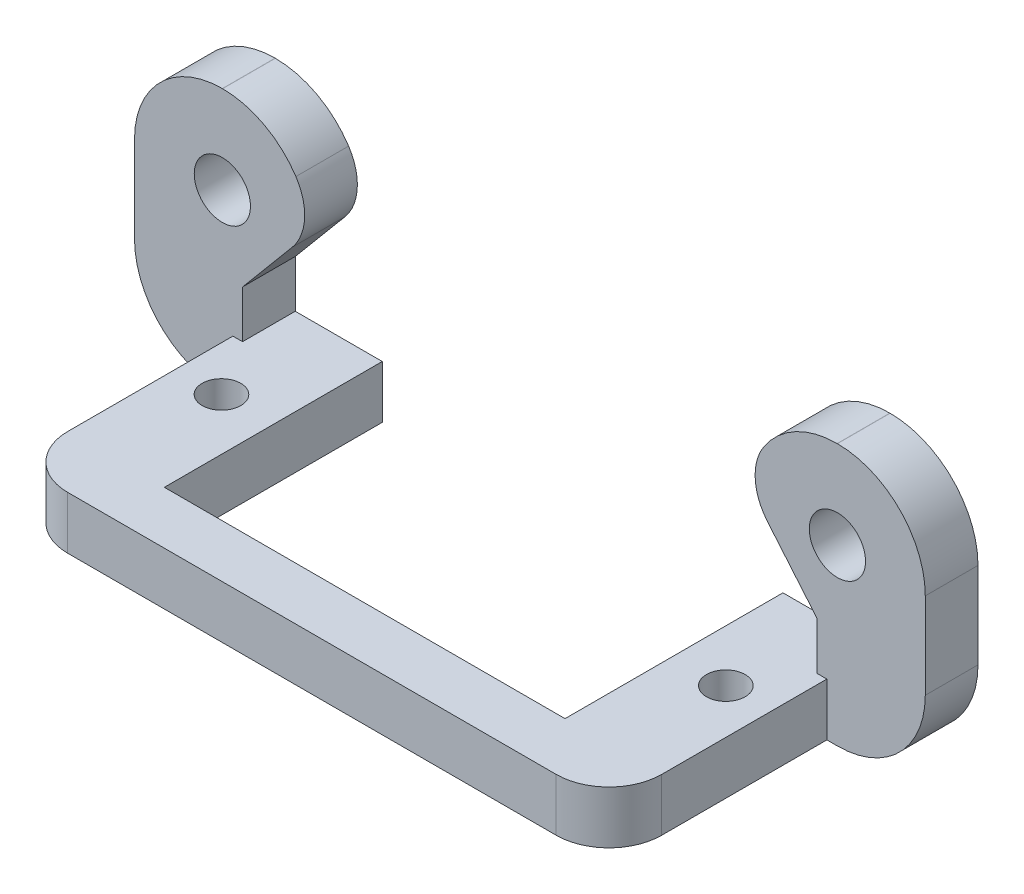
ISO-10303-21;
HEADER;
FILE_DESCRIPTION(('STEP AP214'),'2;1');
FILE_NAME('part.step','',(''),(''),'','','');
FILE_SCHEMA(('AUTOMOTIVE_DESIGN { 1 0 10303 214 1 1 1 1 }'));
ENDSEC;
DATA;
#1=APPLICATION_CONTEXT('core data for automotive mechanical design processes');
#2=APPLICATION_PROTOCOL_DEFINITION('international standard','automotive_design',2000,#1);
#3=PRODUCT_CONTEXT('',#1,'mechanical');
#4=PRODUCT('Part','Part','',(#3));
#5=PRODUCT_RELATED_PRODUCT_CATEGORY('part','',(#4));
#6=PRODUCT_DEFINITION_FORMATION('','',#4);
#7=PRODUCT_DEFINITION_CONTEXT('part definition',#1,'design');
#8=PRODUCT_DEFINITION('design','',#6,#7);
#9=PRODUCT_DEFINITION_SHAPE('','',#8);
#10=(LENGTH_UNIT() NAMED_UNIT(*) SI_UNIT(.MILLI.,.METRE.));
#11=(NAMED_UNIT(*) PLANE_ANGLE_UNIT() SI_UNIT($,.RADIAN.));
#12=(NAMED_UNIT(*) SI_UNIT($,.STERADIAN.) SOLID_ANGLE_UNIT());
#13=UNCERTAINTY_MEASURE_WITH_UNIT(LENGTH_MEASURE(1.E-05),#10,'distance_accuracy_value','');
#14=(GEOMETRIC_REPRESENTATION_CONTEXT(3) GLOBAL_UNCERTAINTY_ASSIGNED_CONTEXT((#13)) GLOBAL_UNIT_ASSIGNED_CONTEXT((#10,
#11,#12)) REPRESENTATION_CONTEXT('',''));
#15=CARTESIAN_POINT('',(0.,0.,0.));
#16=DIRECTION('',(0.,0.,1.));
#17=DIRECTION('',(1.,0.,0.));
#18=AXIS2_PLACEMENT_3D('',#15,#16,#17);
#19=CARTESIAN_POINT('',(16.9,3.,0.));
#20=DIRECTION('',(-1.,0.,0.));
#21=DIRECTION('',(0.,0.,1.));
#22=AXIS2_PLACEMENT_3D('',#19,#20,#21);
#23=PLANE('',#22);
#24=DIRECTION('',(0.,-1.,0.));
#25=VECTOR('',#24,1.);
#26=CARTESIAN_POINT('',(16.9,0.,-3.2));
#27=LINE('',#26,#25);
#28=CARTESIAN_POINT('',(16.9,3.,-3.2));
#29=VERTEX_POINT('',#28);
#30=CARTESIAN_POINT('',(16.9,0.,-3.2));
#31=VERTEX_POINT('',#30);
#32=EDGE_CURVE('E254',#29,#31,#27,.T.);
#33=ORIENTED_EDGE('',*,*,#32,.F.);
#34=DIRECTION('',(0.,0.,-1.));
#35=VECTOR('',#34,1.);
#36=CARTESIAN_POINT('',(16.9,3.,0.));
#37=LINE('',#36,#35);
#38=CARTESIAN_POINT('',(16.9,3.,6.2));
#39=VERTEX_POINT('',#38);
#40=EDGE_CURVE('E318',#39,#29,#37,.T.);
#41=ORIENTED_EDGE('',*,*,#40,.F.);
#42=DIRECTION('',(0.,-1.,0.));
#43=VECTOR('',#42,1.);
#44=CARTESIAN_POINT('',(16.9,3.,6.2));
#45=LINE('',#44,#43);
#46=CARTESIAN_POINT('',(16.9,0.,6.2));
#47=VERTEX_POINT('',#46);
#48=EDGE_CURVE('E376',#39,#47,#45,.T.);
#49=ORIENTED_EDGE('',*,*,#48,.T.);
#50=DIRECTION('',(0.,0.,-1.));
#51=VECTOR('',#50,1.);
#52=CARTESIAN_POINT('',(16.9,0.,0.));
#53=LINE('',#52,#51);
#54=EDGE_CURVE('E346',#47,#31,#53,.T.);
#55=ORIENTED_EDGE('',*,*,#54,.T.);
#56=EDGE_LOOP('',(#33,#41,#49,#55));
#57=FACE_BOUND('',#56,.T.);
#58=ADVANCED_FACE('F40',(#57),#23,.F.);
#59=CARTESIAN_POINT('',(-16.9,3.,0.));
#60=DIRECTION('',(-1.,0.,0.));
#61=DIRECTION('',(0.,0.,1.));
#62=AXIS2_PLACEMENT_3D('',#59,#60,#61);
#63=PLANE('',#62);
#64=DIRECTION('',(0.,0.,-1.));
#65=VECTOR('',#64,1.);
#66=CARTESIAN_POINT('',(-16.9,3.,0.));
#67=LINE('',#66,#65);
#68=CARTESIAN_POINT('',(-16.9,3.,6.2));
#69=VERTEX_POINT('',#68);
#70=CARTESIAN_POINT('',(-16.9,3.00000000000002,-3.2));
#71=VERTEX_POINT('',#70);
#72=EDGE_CURVE('E311',#69,#71,#67,.T.);
#73=ORIENTED_EDGE('',*,*,#72,.T.);
#74=DIRECTION('',(0.,1.,0.));
#75=VECTOR('',#74,1.);
#76=CARTESIAN_POINT('',(-16.9,0.,-3.2));
#77=LINE('',#76,#75);
#78=CARTESIAN_POINT('',(-16.9,0.,-3.2));
#79=VERTEX_POINT('',#78);
#80=EDGE_CURVE('E287',#79,#71,#77,.T.);
#81=ORIENTED_EDGE('',*,*,#80,.F.);
#82=DIRECTION('',(0.,0.,-1.));
#83=VECTOR('',#82,1.);
#84=CARTESIAN_POINT('',(-16.9,0.,0.));
#85=LINE('',#84,#83);
#86=CARTESIAN_POINT('',(-16.9,0.,6.2));
#87=VERTEX_POINT('',#86);
#88=EDGE_CURVE('E308',#87,#79,#85,.T.);
#89=ORIENTED_EDGE('',*,*,#88,.F.);
#90=DIRECTION('',(0.,-1.,0.));
#91=VECTOR('',#90,1.);
#92=CARTESIAN_POINT('',(-16.9,3.,6.2));
#93=LINE('',#92,#91);
#94=EDGE_CURVE('E392',#87,#69,#93,.F.);
#95=ORIENTED_EDGE('',*,*,#94,.T.);
#96=EDGE_LOOP('',(#73,#81,#89,#95));
#97=FACE_BOUND('',#96,.T.);
#98=ADVANCED_FACE('F493',(#97),#63,.T.);
#99=CARTESIAN_POINT('',(0.,3.,0.));
#100=DIRECTION('',(0.,1.,0.));
#101=DIRECTION('',(0.,0.,1.));
#102=AXIS2_PLACEMENT_3D('',#99,#100,#101);
#103=PLANE('',#102);
#104=DIRECTION('',(0.,0.,-1.));
#105=VECTOR('',#104,1.);
#106=CARTESIAN_POINT('',(16.35,3.,-3.2));
#107=LINE('',#106,#105);
#108=CARTESIAN_POINT('',(16.35,3.,-3.2));
#109=VERTEX_POINT('',#108);
#110=CARTESIAN_POINT('',(16.35,3.,-6.2));
#111=VERTEX_POINT('',#110);
#112=EDGE_CURVE('E238',#109,#111,#107,.T.);
#113=ORIENTED_EDGE('',*,*,#112,.T.);
#114=DIRECTION('',(1.,0.,0.));
#115=VECTOR('',#114,1.);
#116=CARTESIAN_POINT('',(0.,3.,-6.2));
#117=LINE('',#116,#115);
#118=CARTESIAN_POINT('',(11.4,3.,-6.2));
#119=VERTEX_POINT('',#118);
#120=EDGE_CURVE('E321',#119,#111,#117,.T.);
#121=ORIENTED_EDGE('',*,*,#120,.F.);
#122=DIRECTION('',(0.,0.,-1.));
#123=VECTOR('',#122,1.);
#124=CARTESIAN_POINT('',(11.4,3.,0.));
#125=LINE('',#124,#123);
#126=CARTESIAN_POINT('',(11.4,3.,6.2));
#127=VERTEX_POINT('',#126);
#128=EDGE_CURVE('E324',#127,#119,#125,.T.);
#129=ORIENTED_EDGE('',*,*,#128,.F.);
#130=DIRECTION('',(-1.,0.,0.));
#131=VECTOR('',#130,1.);
#132=CARTESIAN_POINT('',(0.,3.,6.2));
#133=LINE('',#132,#131);
#134=CARTESIAN_POINT('',(-11.4,3.,6.2));
#135=VERTEX_POINT('',#134);
#136=EDGE_CURVE('E327',#127,#135,#133,.T.);
#137=ORIENTED_EDGE('',*,*,#136,.T.);
#138=DIRECTION('',(0.,0.,-1.));
#139=VECTOR('',#138,1.);
#140=CARTESIAN_POINT('',(-11.4,3.,0.));
#141=LINE('',#140,#139);
#142=CARTESIAN_POINT('',(-11.4,3.,-6.2));
#143=VERTEX_POINT('',#142);
#144=EDGE_CURVE('E329',#135,#143,#141,.T.);
#145=ORIENTED_EDGE('',*,*,#144,.T.);
#146=DIRECTION('',(-1.,0.,0.));
#147=VECTOR('',#146,1.);
#148=CARTESIAN_POINT('',(0.,3.,-6.2));
#149=LINE('',#148,#147);
#150=CARTESIAN_POINT('',(-16.35,3.00000000000002,-6.2));
#151=VERTEX_POINT('',#150);
#152=EDGE_CURVE('E331',#143,#151,#149,.T.);
#153=ORIENTED_EDGE('',*,*,#152,.T.);
#154=DIRECTION('',(0.,0.,-1.));
#155=VECTOR('',#154,1.);
#156=CARTESIAN_POINT('',(-16.35,3.00000000000002,-3.2));
#157=LINE('',#156,#155);
#158=CARTESIAN_POINT('',(-16.35,3.00000000000002,-3.2));
#159=VERTEX_POINT('',#158);
#160=EDGE_CURVE('E306',#159,#151,#157,.T.);
#161=ORIENTED_EDGE('',*,*,#160,.F.);
#162=DIRECTION('',(1.,0.,0.));
#163=VECTOR('',#162,1.);
#164=CARTESIAN_POINT('',(0.,2.99999999999992,-3.2));
#165=LINE('',#164,#163);
#166=EDGE_CURVE('E285',#71,#159,#165,.T.);
#167=ORIENTED_EDGE('',*,*,#166,.F.);
#168=ORIENTED_EDGE('',*,*,#72,.F.);
#169=CARTESIAN_POINT('',(-13.9,3.,6.2));
#170=DIRECTION('',(0.,1.,0.));
#171=DIRECTION('',(0.,0.,1.));
#172=AXIS2_PLACEMENT_3D('',#169,#170,#171);
#173=CIRCLE('',#172,3.);
#174=CARTESIAN_POINT('',(-13.9,3.,9.2));
#175=VERTEX_POINT('',#174);
#176=EDGE_CURVE('E388',#69,#175,#173,.T.);
#177=ORIENTED_EDGE('',*,*,#176,.T.);
#178=DIRECTION('',(1.,0.,0.));
#179=VECTOR('',#178,1.);
#180=CARTESIAN_POINT('',(0.,3.,9.2));
#181=LINE('',#180,#179);
#182=CARTESIAN_POINT('',(13.9,3.,9.2));
#183=VERTEX_POINT('',#182);
#184=EDGE_CURVE('E314',#175,#183,#181,.T.);
#185=ORIENTED_EDGE('',*,*,#184,.T.);
#186=CARTESIAN_POINT('',(13.9,3.,6.2));
#187=DIRECTION('',(0.,1.,0.));
#188=DIRECTION('',(0.,0.,1.));
#189=AXIS2_PLACEMENT_3D('',#186,#187,#188);
#190=CIRCLE('',#189,3.);
#191=EDGE_CURVE('E390',#183,#39,#190,.T.);
#192=ORIENTED_EDGE('',*,*,#191,.T.);
#193=ORIENTED_EDGE('',*,*,#40,.T.);
#194=DIRECTION('',(1.,0.,0.));
#195=VECTOR('',#194,1.);
#196=CARTESIAN_POINT('',(0.,3.,-3.2));
#197=LINE('',#196,#195);
#198=EDGE_CURVE('E252',#109,#29,#197,.T.);
#199=ORIENTED_EDGE('',*,*,#198,.F.);
#200=EDGE_LOOP('',(#113,#121,#129,#137,#145,#153,#161,#167,#168,#177,#185,#192,#193,#199));
#201=FACE_BOUND('',#200,.T.);
#202=CARTESIAN_POINT('',(-14.35,3.,0.));
#203=DIRECTION('',(0.,1.,0.));
#204=DIRECTION('',(0.,0.,1.));
#205=AXIS2_PLACEMENT_3D('',#202,#203,#204);
#206=CIRCLE('',#205,1.1);
#207=CARTESIAN_POINT('',(-14.35,3.,1.1));
#208=VERTEX_POINT('',#207);
#209=EDGE_CURVE('E334',#208,#208,#206,.T.);
#210=ORIENTED_EDGE('',*,*,#209,.F.);
#211=EDGE_LOOP('',(#210));
#212=FACE_BOUND('',#211,.T.);
#213=CARTESIAN_POINT('',(14.35,3.,0.));
#214=DIRECTION('',(0.,1.,0.));
#215=DIRECTION('',(0.,0.,1.));
#216=AXIS2_PLACEMENT_3D('',#213,#214,#215);
#217=CIRCLE('',#216,1.1);
#218=CARTESIAN_POINT('',(14.35,3.,1.1));
#219=VERTEX_POINT('',#218);
#220=EDGE_CURVE('E337',#219,#219,#217,.F.);
#221=ORIENTED_EDGE('',*,*,#220,.T.);
#222=EDGE_LOOP('',(#221));
#223=FACE_BOUND('',#222,.T.);
#224=ADVANCED_FACE('F501',(#201,#212,#223),#103,.T.);
#225=CARTESIAN_POINT('',(0.,3.,9.2));
#226=DIRECTION('',(0.,0.,-1.));
#227=DIRECTION('',(-1.,0.,0.));
#228=AXIS2_PLACEMENT_3D('',#225,#226,#227);
#229=PLANE('',#228);
#230=DIRECTION('',(1.,0.,0.));
#231=VECTOR('',#230,1.);
#232=CARTESIAN_POINT('',(0.,0.,9.2));
#233=LINE('',#232,#231);
#234=CARTESIAN_POINT('',(-13.9,0.,9.2));
#235=VERTEX_POINT('',#234);
#236=CARTESIAN_POINT('',(13.9,0.,9.2));
#237=VERTEX_POINT('',#236);
#238=EDGE_CURVE('E343',#235,#237,#233,.T.);
#239=ORIENTED_EDGE('',*,*,#238,.T.);
#240=DIRECTION('',(0.,-1.,0.));
#241=VECTOR('',#240,1.);
#242=CARTESIAN_POINT('',(13.9,3.,9.2));
#243=LINE('',#242,#241);
#244=EDGE_CURVE('E386',#237,#183,#243,.F.);
#245=ORIENTED_EDGE('',*,*,#244,.T.);
#246=ORIENTED_EDGE('',*,*,#184,.F.);
#247=DIRECTION('',(0.,-1.,0.));
#248=VECTOR('',#247,1.);
#249=CARTESIAN_POINT('',(-13.9,0.,9.2));
#250=LINE('',#249,#248);
#251=EDGE_CURVE('E383',#175,#235,#250,.T.);
#252=ORIENTED_EDGE('',*,*,#251,.T.);
#253=EDGE_LOOP('',(#239,#245,#246,#252));
#254=FACE_BOUND('',#253,.T.);
#255=ADVANCED_FACE('F506',(#254),#229,.F.);
#256=CARTESIAN_POINT('',(0.,3.,-6.2));
#257=DIRECTION('',(0.,0.,-1.));
#258=DIRECTION('',(-1.,0.,0.));
#259=AXIS2_PLACEMENT_3D('',#256,#257,#258);
#260=PLANE('',#259);
#261=DIRECTION('',(-0.64278760968654,0.766044443118977,0.));
#262=VECTOR('',#261,1.);
#263=CARTESIAN_POINT('',(12.4012759485119,10.4059060745241,-6.2));
#264=LINE('',#263,#262);
#265=CARTESIAN_POINT('',(16.35,5.7,-6.2));
#266=VERTEX_POINT('',#265);
#267=CARTESIAN_POINT('',(13.5183862577821,9.07458585012734,-6.2));
#268=VERTEX_POINT('',#267);
#269=EDGE_CURVE('E232',#266,#268,#264,.T.);
#270=ORIENTED_EDGE('',*,*,#269,.T.);
#271=CARTESIAN_POINT('',(15.816519587139,11.002948679187,-6.2));
#272=DIRECTION('',(0.,0.,-1.));
#273=DIRECTION('',(-1.,0.,0.));
#274=AXIS2_PLACEMENT_3D('',#271,#272,#273);
#275=CIRCLE('',#274,3.);
#276=CARTESIAN_POINT('',(13.3139440188635,12.6573716979674,-6.2));
#277=VERTEX_POINT('',#276);
#278=EDGE_CURVE('E445',#268,#277,#275,.T.);
#279=ORIENTED_EDGE('',*,*,#278,.T.);
#280=CARTESIAN_POINT('',(17.4849032993227,9.90000000000001,-6.2));
#281=DIRECTION('',(0.,0.,-1.));
#282=DIRECTION('',(-1.,0.,0.));
#283=AXIS2_PLACEMENT_3D('',#280,#281,#282);
#284=CIRCLE('',#283,5.);
#285=CARTESIAN_POINT('',(17.4849032993227,14.9,-6.2));
#286=VERTEX_POINT('',#285);
#287=EDGE_CURVE('E401',#277,#286,#284,.T.);
#288=ORIENTED_EDGE('',*,*,#287,.T.);
#289=DIRECTION('',(-1.,0.,0.));
#290=VECTOR('',#289,1.);
#291=CARTESIAN_POINT('',(0.,14.9,-6.2));
#292=LINE('',#291,#290);
#293=CARTESIAN_POINT('',(17.5,14.9,-6.2));
#294=VERTEX_POINT('',#293);
#295=EDGE_CURVE('E269',#294,#286,#292,.T.);
#296=ORIENTED_EDGE('',*,*,#295,.F.);
#297=CARTESIAN_POINT('',(17.5,9.90000000000001,-6.2));
#298=DIRECTION('',(0.,0.,-1.));
#299=DIRECTION('',(-1.,0.,0.));
#300=AXIS2_PLACEMENT_3D('',#297,#298,#299);
#301=CIRCLE('',#300,5.);
#302=CARTESIAN_POINT('',(22.5,9.90000000000001,-6.2));
#303=VERTEX_POINT('',#302);
#304=EDGE_CURVE('E399',#294,#303,#301,.T.);
#305=ORIENTED_EDGE('',*,*,#304,.T.);
#306=DIRECTION('',(0.,-1.,0.));
#307=VECTOR('',#306,1.);
#308=CARTESIAN_POINT('',(22.5,0.,-6.2));
#309=LINE('',#308,#307);
#310=CARTESIAN_POINT('',(22.5,5.,-6.2));
#311=VERTEX_POINT('',#310);
#312=EDGE_CURVE('E263',#303,#311,#309,.T.);
#313=ORIENTED_EDGE('',*,*,#312,.T.);
#314=CARTESIAN_POINT('',(17.5,5.,-6.2));
#315=DIRECTION('',(0.,0.,-1.));
#316=DIRECTION('',(-1.,0.,0.));
#317=AXIS2_PLACEMENT_3D('',#314,#315,#316);
#318=CIRCLE('',#317,5.);
#319=CARTESIAN_POINT('',(17.5,0.,-6.2));
#320=VERTEX_POINT('',#319);
#321=EDGE_CURVE('E403',#311,#320,#318,.T.);
#322=ORIENTED_EDGE('',*,*,#321,.T.);
#323=DIRECTION('',(1.,0.,0.));
#324=VECTOR('',#323,1.);
#325=CARTESIAN_POINT('',(0.,0.,-6.2));
#326=LINE('',#325,#324);
#327=CARTESIAN_POINT('',(11.4,0.,-6.2));
#328=VERTEX_POINT('',#327);
#329=EDGE_CURVE('E349',#328,#320,#326,.T.);
#330=ORIENTED_EDGE('',*,*,#329,.F.);
#331=DIRECTION('',(0.,-1.,0.));
#332=VECTOR('',#331,1.);
#333=CARTESIAN_POINT('',(11.4,3.,-6.2));
#334=LINE('',#333,#332);
#335=EDGE_CURVE('E374',#119,#328,#334,.T.);
#336=ORIENTED_EDGE('',*,*,#335,.F.);
#337=ORIENTED_EDGE('',*,*,#120,.T.);
#338=DIRECTION('',(0.,1.,0.));
#339=VECTOR('',#338,1.);
#340=CARTESIAN_POINT('',(16.35,0.,-6.2));
#341=LINE('',#340,#339);
#342=EDGE_CURVE('E266',#111,#266,#341,.T.);
#343=ORIENTED_EDGE('',*,*,#342,.T.);
#344=EDGE_LOOP('',(#270,#279,#288,#296,#305,#313,#322,#330,#336,#337,#343));
#345=FACE_BOUND('',#344,.T.);
#346=CARTESIAN_POINT('',(17.5,9.90000000000001,-6.2));
#347=DIRECTION('',(0.,0.,-1.));
#348=DIRECTION('',(-1.,0.,0.));
#349=AXIS2_PLACEMENT_3D('',#346,#347,#348);
#350=CIRCLE('',#349,1.6);
#351=CARTESIAN_POINT('',(15.9,9.90000000000001,-6.2));
#352=VERTEX_POINT('',#351);
#353=EDGE_CURVE('E260',#352,#352,#350,.T.);
#354=ORIENTED_EDGE('',*,*,#353,.F.);
#355=EDGE_LOOP('',(#354));
#356=FACE_BOUND('',#355,.T.);
#357=ADVANCED_FACE('F532',(#345,#356),#260,.T.);
#358=CARTESIAN_POINT('',(11.4,3.,0.));
#359=DIRECTION('',(-1.,0.,0.));
#360=DIRECTION('',(0.,0.,1.));
#361=AXIS2_PLACEMENT_3D('',#358,#359,#360);
#362=PLANE('',#361);
#363=DIRECTION('',(0.,0.,-1.));
#364=VECTOR('',#363,1.);
#365=CARTESIAN_POINT('',(11.4,0.,0.));
#366=LINE('',#365,#364);
#367=CARTESIAN_POINT('',(11.4,0.,6.2));
#368=VERTEX_POINT('',#367);
#369=EDGE_CURVE('E352',#368,#328,#366,.T.);
#370=ORIENTED_EDGE('',*,*,#369,.F.);
#371=DIRECTION('',(0.,-1.,0.));
#372=VECTOR('',#371,1.);
#373=CARTESIAN_POINT('',(11.4,3.,6.2));
#374=LINE('',#373,#372);
#375=EDGE_CURVE('E372',#127,#368,#374,.T.);
#376=ORIENTED_EDGE('',*,*,#375,.F.);
#377=ORIENTED_EDGE('',*,*,#128,.T.);
#378=ORIENTED_EDGE('',*,*,#335,.T.);
#379=EDGE_LOOP('',(#370,#376,#377,#378));
#380=FACE_BOUND('',#379,.T.);
#381=ADVANCED_FACE('F534',(#380),#362,.T.);
#382=CARTESIAN_POINT('',(0.,3.,6.2));
#383=DIRECTION('',(0.,0.,1.));
#384=DIRECTION('',(1.,0.,0.));
#385=AXIS2_PLACEMENT_3D('',#382,#383,#384);
#386=PLANE('',#385);
#387=DIRECTION('',(-1.,0.,0.));
#388=VECTOR('',#387,1.);
#389=CARTESIAN_POINT('',(0.,0.,6.2));
#390=LINE('',#389,#388);
#391=CARTESIAN_POINT('',(-11.4,0.,6.2));
#392=VERTEX_POINT('',#391);
#393=EDGE_CURVE('E355',#368,#392,#390,.T.);
#394=ORIENTED_EDGE('',*,*,#393,.T.);
#395=DIRECTION('',(0.,-1.,0.));
#396=VECTOR('',#395,1.);
#397=CARTESIAN_POINT('',(-11.4,3.,6.2));
#398=LINE('',#397,#396);
#399=EDGE_CURVE('E369',#135,#392,#398,.T.);
#400=ORIENTED_EDGE('',*,*,#399,.F.);
#401=ORIENTED_EDGE('',*,*,#136,.F.);
#402=ORIENTED_EDGE('',*,*,#375,.T.);
#403=EDGE_LOOP('',(#394,#400,#401,#402));
#404=FACE_BOUND('',#403,.T.);
#405=ADVANCED_FACE('F542',(#404),#386,.F.);
#406=CARTESIAN_POINT('',(-11.4,3.,0.));
#407=DIRECTION('',(-1.,0.,0.));
#408=DIRECTION('',(0.,0.,1.));
#409=AXIS2_PLACEMENT_3D('',#406,#407,#408);
#410=PLANE('',#409);
#411=DIRECTION('',(0.,0.,-1.));
#412=VECTOR('',#411,1.);
#413=CARTESIAN_POINT('',(-11.4,0.,0.));
#414=LINE('',#413,#412);
#415=CARTESIAN_POINT('',(-11.4,0.,-6.2));
#416=VERTEX_POINT('',#415);
#417=EDGE_CURVE('E357',#392,#416,#414,.T.);
#418=ORIENTED_EDGE('',*,*,#417,.T.);
#419=DIRECTION('',(0.,-1.,0.));
#420=VECTOR('',#419,1.);
#421=CARTESIAN_POINT('',(-11.4,3.,-6.2));
#422=LINE('',#421,#420);
#423=EDGE_CURVE('E340',#143,#416,#422,.T.);
#424=ORIENTED_EDGE('',*,*,#423,.F.);
#425=ORIENTED_EDGE('',*,*,#144,.F.);
#426=ORIENTED_EDGE('',*,*,#399,.T.);
#427=EDGE_LOOP('',(#418,#424,#425,#426));
#428=FACE_BOUND('',#427,.T.);
#429=ADVANCED_FACE('F595',(#428),#410,.F.);
#430=CARTESIAN_POINT('',(-14.35,3.,0.));
#431=DIRECTION('',(0.,-1.,0.));
#432=DIRECTION('',(0.,0.,-1.));
#433=AXIS2_PLACEMENT_3D('',#430,#431,#432);
#434=CYLINDRICAL_SURFACE('',#433,1.1);
#435=ORIENTED_EDGE('',*,*,#209,.T.);
#436=EDGE_LOOP('',(#435));
#437=FACE_BOUND('',#436,.T.);
#438=CARTESIAN_POINT('',(-14.35,0.,0.));
#439=DIRECTION('',(0.,1.,0.));
#440=DIRECTION('',(0.,0.,1.));
#441=AXIS2_PLACEMENT_3D('',#438,#439,#440);
#442=CIRCLE('',#441,1.1);
#443=CARTESIAN_POINT('',(-14.35,0.,1.1));
#444=VERTEX_POINT('',#443);
#445=EDGE_CURVE('E362',#444,#444,#442,.T.);
#446=ORIENTED_EDGE('',*,*,#445,.F.);
#447=EDGE_LOOP('',(#446));
#448=FACE_BOUND('',#447,.T.);
#449=ADVANCED_FACE('F625',(#437,#448),#434,.F.);
#450=CARTESIAN_POINT('',(0.,3.,-6.2));
#451=DIRECTION('',(0.,0.,1.));
#452=DIRECTION('',(1.,0.,0.));
#453=AXIS2_PLACEMENT_3D('',#450,#451,#452);
#454=PLANE('',#453);
#455=CARTESIAN_POINT('',(-17.4849032993227,9.90000000000002,-6.2));
#456=DIRECTION('',(0.,0.,1.));
#457=DIRECTION('',(1.,0.,0.));
#458=AXIS2_PLACEMENT_3D('',#455,#456,#457);
#459=CIRCLE('',#458,5.);
#460=CARTESIAN_POINT('',(-17.4849032993227,14.9,-6.2));
#461=VERTEX_POINT('',#460);
#462=CARTESIAN_POINT('',(-13.3139440188635,12.6573716979674,-6.2));
#463=VERTEX_POINT('',#462);
#464=EDGE_CURVE('E416',#461,#463,#459,.F.);
#465=ORIENTED_EDGE('',*,*,#464,.T.);
#466=CARTESIAN_POINT('',(-15.816519587139,11.002948679187,-6.2));
#467=DIRECTION('',(0.,0.,1.));
#468=DIRECTION('',(1.,0.,0.));
#469=AXIS2_PLACEMENT_3D('',#466,#467,#468);
#470=CIRCLE('',#469,3.);
#471=CARTESIAN_POINT('',(-13.5183862577821,9.07458585012735,-6.2));
#472=VERTEX_POINT('',#471);
#473=EDGE_CURVE('E62',#463,#472,#470,.F.);
#474=ORIENTED_EDGE('',*,*,#473,.T.);
#475=DIRECTION('',(0.642787609686541,0.766044443118977,0.));
#476=VECTOR('',#475,1.);
#477=CARTESIAN_POINT('',(-12.4012759485119,10.4059060745241,-6.2));
#478=LINE('',#477,#476);
#479=CARTESIAN_POINT('',(-16.35,5.70000000000002,-6.2));
#480=VERTEX_POINT('',#479);
#481=EDGE_CURVE('E300',#480,#472,#478,.T.);
#482=ORIENTED_EDGE('',*,*,#481,.F.);
#483=DIRECTION('',(0.,1.,0.));
#484=VECTOR('',#483,1.);
#485=CARTESIAN_POINT('',(-16.35,0.,-6.2));
#486=LINE('',#485,#484);
#487=EDGE_CURVE('E302',#151,#480,#486,.T.);
#488=ORIENTED_EDGE('',*,*,#487,.F.);
#489=ORIENTED_EDGE('',*,*,#152,.F.);
#490=ORIENTED_EDGE('',*,*,#423,.T.);
#491=DIRECTION('',(-1.,0.,0.));
#492=VECTOR('',#491,1.);
#493=CARTESIAN_POINT('',(0.,0.,-6.2));
#494=LINE('',#493,#492);
#495=CARTESIAN_POINT('',(-17.5,0.,-6.2));
#496=VERTEX_POINT('',#495);
#497=EDGE_CURVE('E359',#416,#496,#494,.T.);
#498=ORIENTED_EDGE('',*,*,#497,.T.);
#499=CARTESIAN_POINT('',(-17.5,5.,-6.2));
#500=DIRECTION('',(0.,0.,1.));
#501=DIRECTION('',(1.,0.,0.));
#502=AXIS2_PLACEMENT_3D('',#499,#500,#501);
#503=CIRCLE('',#502,5.);
#504=CARTESIAN_POINT('',(-22.5,5.,-6.2));
#505=VERTEX_POINT('',#504);
#506=EDGE_CURVE('E420',#496,#505,#503,.F.);
#507=ORIENTED_EDGE('',*,*,#506,.T.);
#508=DIRECTION('',(0.,-1.,0.));
#509=VECTOR('',#508,1.);
#510=CARTESIAN_POINT('',(-22.5,0.,-6.2));
#511=LINE('',#510,#509);
#512=CARTESIAN_POINT('',(-22.5,9.90000000000002,-6.2));
#513=VERTEX_POINT('',#512);
#514=EDGE_CURVE('E237',#513,#505,#511,.T.);
#515=ORIENTED_EDGE('',*,*,#514,.F.);
#516=CARTESIAN_POINT('',(-17.5,9.90000000000002,-6.2));
#517=DIRECTION('',(0.,0.,1.));
#518=DIRECTION('',(1.,0.,0.));
#519=AXIS2_PLACEMENT_3D('',#516,#517,#518);
#520=CIRCLE('',#519,5.);
#521=CARTESIAN_POINT('',(-17.5,14.9,-6.2));
#522=VERTEX_POINT('',#521);
#523=EDGE_CURVE('E418',#513,#522,#520,.F.);
#524=ORIENTED_EDGE('',*,*,#523,.T.);
#525=DIRECTION('',(1.,0.,0.));
#526=VECTOR('',#525,1.);
#527=CARTESIAN_POINT('',(0.,14.9,-6.2));
#528=LINE('',#527,#526);
#529=EDGE_CURVE('E297',#522,#461,#528,.T.);
#530=ORIENTED_EDGE('',*,*,#529,.T.);
#531=EDGE_LOOP('',(#465,#474,#482,#488,#489,#490,#498,#507,#515,#524,#530));
#532=FACE_BOUND('',#531,.T.);
#533=CARTESIAN_POINT('',(-17.5,9.90000000000003,-6.2));
#534=DIRECTION('',(0.,0.,-1.));
#535=DIRECTION('',(-1.,0.,0.));
#536=AXIS2_PLACEMENT_3D('',#533,#534,#535);
#537=CIRCLE('',#536,1.6);
#538=CARTESIAN_POINT('',(-19.1,9.90000000000003,-6.2));
#539=VERTEX_POINT('',#538);
#540=EDGE_CURVE('E278',#539,#539,#537,.F.);
#541=ORIENTED_EDGE('',*,*,#540,.T.);
#542=EDGE_LOOP('',(#541));
#543=FACE_BOUND('',#542,.T.);
#544=ADVANCED_FACE('F460',(#532,#543),#454,.F.);
#545=CARTESIAN_POINT('',(14.35,3.,0.));
#546=DIRECTION('',(0.,-1.,0.));
#547=DIRECTION('',(0.,0.,-1.));
#548=AXIS2_PLACEMENT_3D('',#545,#546,#547);
#549=CYLINDRICAL_SURFACE('',#548,1.1);
#550=ORIENTED_EDGE('',*,*,#220,.F.);
#551=EDGE_LOOP('',(#550));
#552=FACE_BOUND('',#551,.T.);
#553=CARTESIAN_POINT('',(14.35,0.,0.));
#554=DIRECTION('',(0.,1.,0.));
#555=DIRECTION('',(0.,0.,1.));
#556=AXIS2_PLACEMENT_3D('',#553,#554,#555);
#557=CIRCLE('',#556,1.1);
#558=CARTESIAN_POINT('',(14.35,0.,1.1));
#559=VERTEX_POINT('',#558);
#560=EDGE_CURVE('E315',#559,#559,#557,.F.);
#561=ORIENTED_EDGE('',*,*,#560,.T.);
#562=EDGE_LOOP('',(#561));
#563=FACE_BOUND('',#562,.T.);
#564=ADVANCED_FACE('F621',(#552,#563),#549,.F.);
#565=CARTESIAN_POINT('',(0.,0.,0.));
#566=DIRECTION('',(0.,1.,0.));
#567=DIRECTION('',(0.,0.,1.));
#568=AXIS2_PLACEMENT_3D('',#565,#566,#567);
#569=PLANE('',#568);
#570=ORIENTED_EDGE('',*,*,#329,.T.);
#571=DIRECTION('',(0.,0.,-1.));
#572=VECTOR('',#571,1.);
#573=CARTESIAN_POINT('',(17.5,0.,-3.2));
#574=LINE('',#573,#572);
#575=CARTESIAN_POINT('',(17.5,0.,-3.2));
#576=VERTEX_POINT('',#575);
#577=EDGE_CURVE('E408',#320,#576,#574,.F.);
#578=ORIENTED_EDGE('',*,*,#577,.T.);
#579=DIRECTION('',(-1.,0.,0.));
#580=VECTOR('',#579,1.);
#581=CARTESIAN_POINT('',(0.,0.,-3.2));
#582=LINE('',#581,#580);
#583=EDGE_CURVE('E516',#576,#31,#582,.T.);
#584=ORIENTED_EDGE('',*,*,#583,.T.);
#585=ORIENTED_EDGE('',*,*,#54,.F.);
#586=CARTESIAN_POINT('',(13.9,0.,6.2));
#587=DIRECTION('',(0.,1.,0.));
#588=DIRECTION('',(0.,0.,1.));
#589=AXIS2_PLACEMENT_3D('',#586,#587,#588);
#590=CIRCLE('',#589,3.);
#591=EDGE_CURVE('E381',#47,#237,#590,.F.);
#592=ORIENTED_EDGE('',*,*,#591,.T.);
#593=ORIENTED_EDGE('',*,*,#238,.F.);
#594=CARTESIAN_POINT('',(-13.9,0.,6.2));
#595=DIRECTION('',(0.,1.,0.));
#596=DIRECTION('',(0.,0.,1.));
#597=AXIS2_PLACEMENT_3D('',#594,#595,#596);
#598=CIRCLE('',#597,3.);
#599=EDGE_CURVE('E379',#235,#87,#598,.F.);
#600=ORIENTED_EDGE('',*,*,#599,.T.);
#601=ORIENTED_EDGE('',*,*,#88,.T.);
#602=DIRECTION('',(1.,0.,0.));
#603=VECTOR('',#602,1.);
#604=CARTESIAN_POINT('',(0.,0.,-3.2));
#605=LINE('',#604,#603);
#606=CARTESIAN_POINT('',(-17.5,0.,-3.2));
#607=VERTEX_POINT('',#606);
#608=EDGE_CURVE('E289',#607,#79,#605,.T.);
#609=ORIENTED_EDGE('',*,*,#608,.F.);
#610=DIRECTION('',(0.,0.,-1.));
#611=VECTOR('',#610,1.);
#612=CARTESIAN_POINT('',(-17.5,0.,0.));
#613=LINE('',#612,#611);
#614=EDGE_CURVE('E405',#607,#496,#613,.T.);
#615=ORIENTED_EDGE('',*,*,#614,.T.);
#616=ORIENTED_EDGE('',*,*,#497,.F.);
#617=ORIENTED_EDGE('',*,*,#417,.F.);
#618=ORIENTED_EDGE('',*,*,#393,.F.);
#619=ORIENTED_EDGE('',*,*,#369,.T.);
#620=EDGE_LOOP('',(#570,#578,#584,#585,#592,#593,#600,#601,#609,#615,#616,#617,#618,#619));
#621=FACE_BOUND('',#620,.T.);
#622=ORIENTED_EDGE('',*,*,#445,.T.);
#623=EDGE_LOOP('',(#622));
#624=FACE_BOUND('',#623,.T.);
#625=ORIENTED_EDGE('',*,*,#560,.F.);
#626=EDGE_LOOP('',(#625));
#627=FACE_BOUND('',#626,.T.);
#628=ADVANCED_FACE('F486',(#621,#624,#627),#569,.F.);
#629=CARTESIAN_POINT('',(13.9,3.,6.2));
#630=DIRECTION('',(0.,-1.,0.));
#631=DIRECTION('',(0.,0.,-1.));
#632=AXIS2_PLACEMENT_3D('',#629,#630,#631);
#633=CYLINDRICAL_SURFACE('',#632,3.);
#634=ORIENTED_EDGE('',*,*,#191,.F.);
#635=ORIENTED_EDGE('',*,*,#244,.F.);
#636=ORIENTED_EDGE('',*,*,#591,.F.);
#637=ORIENTED_EDGE('',*,*,#48,.F.);
#638=EDGE_LOOP('',(#634,#635,#636,#637));
#639=FACE_BOUND('',#638,.T.);
#640=ADVANCED_FACE('F509',(#639),#633,.T.);
#641=CARTESIAN_POINT('',(-13.9,3.,6.2));
#642=DIRECTION('',(0.,1.,0.));
#643=DIRECTION('',(0.,0.,1.));
#644=AXIS2_PLACEMENT_3D('',#641,#642,#643);
#645=CYLINDRICAL_SURFACE('',#644,3.);
#646=ORIENTED_EDGE('',*,*,#176,.F.);
#647=ORIENTED_EDGE('',*,*,#94,.F.);
#648=ORIENTED_EDGE('',*,*,#599,.F.);
#649=ORIENTED_EDGE('',*,*,#251,.F.);
#650=EDGE_LOOP('',(#646,#647,#648,#649));
#651=FACE_BOUND('',#650,.T.);
#652=ADVANCED_FACE('F497',(#651),#645,.T.);
#653=CARTESIAN_POINT('',(-22.5,0.,-3.2));
#654=DIRECTION('',(1.,0.,0.));
#655=DIRECTION('',(0.,0.,-1.));
#656=AXIS2_PLACEMENT_3D('',#653,#654,#655);
#657=PLANE('',#656);
#658=ORIENTED_EDGE('',*,*,#514,.T.);
#659=DIRECTION('',(0.,0.,-1.));
#660=VECTOR('',#659,1.);
#661=CARTESIAN_POINT('',(-22.5,5.,-3.2));
#662=LINE('',#661,#660);
#663=CARTESIAN_POINT('',(-22.5,5.,-3.2));
#664=VERTEX_POINT('',#663);
#665=EDGE_CURVE('E425',#505,#664,#662,.F.);
#666=ORIENTED_EDGE('',*,*,#665,.T.);
#667=DIRECTION('',(0.,-1.,0.));
#668=VECTOR('',#667,1.);
#669=CARTESIAN_POINT('',(-22.5,0.,-3.2));
#670=LINE('',#669,#668);
#671=CARTESIAN_POINT('',(-22.5,9.90000000000002,-3.2));
#672=VERTEX_POINT('',#671);
#673=EDGE_CURVE('E274',#672,#664,#670,.T.);
#674=ORIENTED_EDGE('',*,*,#673,.F.);
#675=DIRECTION('',(0.,0.,-1.));
#676=VECTOR('',#675,1.);
#677=CARTESIAN_POINT('',(-22.5,9.90000000000002,-6.2));
#678=LINE('',#677,#676);
#679=EDGE_CURVE('E422',#672,#513,#678,.T.);
#680=ORIENTED_EDGE('',*,*,#679,.T.);
#681=EDGE_LOOP('',(#658,#666,#674,#680));
#682=FACE_BOUND('',#681,.T.);
#683=ADVANCED_FACE('F478',(#682),#657,.F.);
#684=CARTESIAN_POINT('',(-16.35,0.,-3.2));
#685=DIRECTION('',(-1.,0.,0.));
#686=DIRECTION('',(0.,-1.,0.));
#687=AXIS2_PLACEMENT_3D('',#684,#685,#686);
#688=PLANE('',#687);
#689=ORIENTED_EDGE('',*,*,#487,.T.);
#690=DIRECTION('',(0.,0.,-1.));
#691=VECTOR('',#690,1.);
#692=CARTESIAN_POINT('',(-16.35,5.70000000000002,-3.2));
#693=LINE('',#692,#691);
#694=CARTESIAN_POINT('',(-16.35,5.70000000000002,-3.2));
#695=VERTEX_POINT('',#694);
#696=EDGE_CURVE('E294',#695,#480,#693,.T.);
#697=ORIENTED_EDGE('',*,*,#696,.F.);
#698=DIRECTION('',(0.,1.,0.));
#699=VECTOR('',#698,1.);
#700=CARTESIAN_POINT('',(-16.35,0.,-3.2));
#701=LINE('',#700,#699);
#702=EDGE_CURVE('E283',#159,#695,#701,.T.);
#703=ORIENTED_EDGE('',*,*,#702,.F.);
#704=ORIENTED_EDGE('',*,*,#160,.T.);
#705=EDGE_LOOP('',(#689,#697,#703,#704));
#706=FACE_BOUND('',#705,.T.);
#707=ADVANCED_FACE('F600',(#706),#688,.F.);
#708=CARTESIAN_POINT('',(-12.4012759485119,10.4059060745241,-3.2));
#709=DIRECTION('',(-0.766044443118976,0.642787609686541,0.));
#710=DIRECTION('',(-0.642787609686541,-0.766044443118977,0.));
#711=AXIS2_PLACEMENT_3D('',#708,#709,#710);
#712=PLANE('',#711);
#713=ORIENTED_EDGE('',*,*,#481,.T.);
#714=DIRECTION('',(0.,0.,1.));
#715=VECTOR('',#714,1.);
#716=CARTESIAN_POINT('',(-13.5183862577821,9.07458585012735,-3.2));
#717=LINE('',#716,#715);
#718=CARTESIAN_POINT('',(-13.5183862577821,9.07458585012735,-3.2));
#719=VERTEX_POINT('',#718);
#720=EDGE_CURVE('E48',#472,#719,#717,.T.);
#721=ORIENTED_EDGE('',*,*,#720,.T.);
#722=DIRECTION('',(0.642787609686541,0.766044443118977,0.));
#723=VECTOR('',#722,1.);
#724=CARTESIAN_POINT('',(-12.4012759485119,10.4059060745241,-3.2));
#725=LINE('',#724,#723);
#726=EDGE_CURVE('E281',#695,#719,#725,.T.);
#727=ORIENTED_EDGE('',*,*,#726,.F.);
#728=ORIENTED_EDGE('',*,*,#696,.T.);
#729=EDGE_LOOP('',(#713,#721,#727,#728));
#730=FACE_BOUND('',#729,.T.);
#731=ADVANCED_FACE('F602',(#730),#712,.F.);
#732=CARTESIAN_POINT('',(0.,14.9,-3.2));
#733=DIRECTION('',(0.,1.,0.));
#734=DIRECTION('',(-1.,0.,0.));
#735=AXIS2_PLACEMENT_3D('',#732,#733,#734);
#736=PLANE('',#735);
#737=ORIENTED_EDGE('',*,*,#529,.F.);
#738=DIRECTION('',(0.,0.,-1.));
#739=VECTOR('',#738,1.);
#740=CARTESIAN_POINT('',(-17.5,14.9,-3.2));
#741=LINE('',#740,#739);
#742=CARTESIAN_POINT('',(-17.5,14.9,-3.2));
#743=VERTEX_POINT('',#742);
#744=EDGE_CURVE('E436',#522,#743,#741,.F.);
#745=ORIENTED_EDGE('',*,*,#744,.T.);
#746=DIRECTION('',(1.,0.,0.));
#747=VECTOR('',#746,1.);
#748=CARTESIAN_POINT('',(0.,14.9,-3.2));
#749=LINE('',#748,#747);
#750=CARTESIAN_POINT('',(-17.4849032993227,14.9,-3.2));
#751=VERTEX_POINT('',#750);
#752=EDGE_CURVE('E277',#743,#751,#749,.T.);
#753=ORIENTED_EDGE('',*,*,#752,.T.);
#754=DIRECTION('',(0.,0.,1.));
#755=VECTOR('',#754,1.);
#756=CARTESIAN_POINT('',(-17.4849032993227,14.9,-6.2));
#757=LINE('',#756,#755);
#758=EDGE_CURVE('E433',#751,#461,#757,.F.);
#759=ORIENTED_EDGE('',*,*,#758,.T.);
#760=EDGE_LOOP('',(#737,#745,#753,#759));
#761=FACE_BOUND('',#760,.T.);
#762=ADVANCED_FACE('F466',(#761),#736,.T.);
#763=CARTESIAN_POINT('',(-17.5,9.90000000000003,-3.2));
#764=DIRECTION('',(0.,0.,-1.));
#765=DIRECTION('',(-1.,0.,0.));
#766=AXIS2_PLACEMENT_3D('',#763,#764,#765);
#767=CYLINDRICAL_SURFACE('',#766,1.6);
#768=CARTESIAN_POINT('',(-17.5,9.90000000000003,-3.2));
#769=DIRECTION('',(0.,0.,-1.));
#770=DIRECTION('',(-1.,0.,0.));
#771=AXIS2_PLACEMENT_3D('',#768,#769,#770);
#772=CIRCLE('',#771,1.6);
#773=CARTESIAN_POINT('',(-19.1,9.90000000000003,-3.2));
#774=VERTEX_POINT('',#773);
#775=EDGE_CURVE('E291',#774,#774,#772,.F.);
#776=ORIENTED_EDGE('',*,*,#775,.T.);
#777=EDGE_LOOP('',(#776));
#778=FACE_BOUND('',#777,.T.);
#779=ORIENTED_EDGE('',*,*,#540,.F.);
#780=EDGE_LOOP('',(#779));
#781=FACE_BOUND('',#780,.T.);
#782=ADVANCED_FACE('F609',(#778,#781),#767,.F.);
#783=CARTESIAN_POINT('',(0.,0.,-3.2));
#784=DIRECTION('',(0.,0.,-1.));
#785=DIRECTION('',(-1.,0.,0.));
#786=AXIS2_PLACEMENT_3D('',#783,#784,#785);
#787=PLANE('',#786);
#788=ORIENTED_EDGE('',*,*,#726,.T.);
#789=CARTESIAN_POINT('',(-15.816519587139,11.002948679187,-3.2));
#790=DIRECTION('',(0.,0.,-1.));
#791=DIRECTION('',(-1.,0.,0.));
#792=AXIS2_PLACEMENT_3D('',#789,#790,#791);
#793=CIRCLE('',#792,3.);
#794=CARTESIAN_POINT('',(-13.3139440188635,12.6573716979674,-3.2));
#795=VERTEX_POINT('',#794);
#796=EDGE_CURVE('E11',#719,#795,#793,.F.);
#797=ORIENTED_EDGE('',*,*,#796,.T.);
#798=CARTESIAN_POINT('',(-17.4849032993227,9.90000000000002,-3.2));
#799=DIRECTION('',(0.,0.,-1.));
#800=DIRECTION('',(-1.,0.,0.));
#801=AXIS2_PLACEMENT_3D('',#798,#799,#800);
#802=CIRCLE('',#801,5.);
#803=EDGE_CURVE('E427',#795,#751,#802,.F.);
#804=ORIENTED_EDGE('',*,*,#803,.T.);
#805=ORIENTED_EDGE('',*,*,#752,.F.);
#806=CARTESIAN_POINT('',(-17.5,9.90000000000002,-3.2));
#807=DIRECTION('',(0.,0.,-1.));
#808=DIRECTION('',(-1.,0.,0.));
#809=AXIS2_PLACEMENT_3D('',#806,#807,#808);
#810=CIRCLE('',#809,5.);
#811=EDGE_CURVE('E429',#743,#672,#810,.F.);
#812=ORIENTED_EDGE('',*,*,#811,.T.);
#813=ORIENTED_EDGE('',*,*,#673,.T.);
#814=CARTESIAN_POINT('',(-17.5,5.,-3.2));
#815=DIRECTION('',(0.,0.,-1.));
#816=DIRECTION('',(-1.,0.,0.));
#817=AXIS2_PLACEMENT_3D('',#814,#815,#816);
#818=CIRCLE('',#817,5.);
#819=EDGE_CURVE('E431',#664,#607,#818,.F.);
#820=ORIENTED_EDGE('',*,*,#819,.T.);
#821=ORIENTED_EDGE('',*,*,#608,.T.);
#822=ORIENTED_EDGE('',*,*,#80,.T.);
#823=ORIENTED_EDGE('',*,*,#166,.T.);
#824=ORIENTED_EDGE('',*,*,#702,.T.);
#825=EDGE_LOOP('',(#788,#797,#804,#805,#812,#813,#820,#821,#822,#823,#824));
#826=FACE_BOUND('',#825,.T.);
#827=ORIENTED_EDGE('',*,*,#775,.F.);
#828=EDGE_LOOP('',(#827));
#829=FACE_BOUND('',#828,.T.);
#830=ADVANCED_FACE('F474',(#826,#829),#787,.F.);
#831=CARTESIAN_POINT('',(22.5,0.,-3.2));
#832=DIRECTION('',(1.,0.,0.));
#833=DIRECTION('',(0.,0.,-1.));
#834=AXIS2_PLACEMENT_3D('',#831,#832,#833);
#835=PLANE('',#834);
#836=DIRECTION('',(0.,-1.,0.));
#837=VECTOR('',#836,1.);
#838=CARTESIAN_POINT('',(22.5,0.,-3.2));
#839=LINE('',#838,#837);
#840=CARTESIAN_POINT('',(22.5,9.90000000000001,-3.2));
#841=VERTEX_POINT('',#840);
#842=CARTESIAN_POINT('',(22.5,5.,-3.2));
#843=VERTEX_POINT('',#842);
#844=EDGE_CURVE('E517',#841,#843,#839,.T.);
#845=ORIENTED_EDGE('',*,*,#844,.T.);
#846=DIRECTION('',(0.,0.,-1.));
#847=VECTOR('',#846,1.);
#848=CARTESIAN_POINT('',(22.5,5.,-6.2));
#849=LINE('',#848,#847);
#850=EDGE_CURVE('E396',#843,#311,#849,.T.);
#851=ORIENTED_EDGE('',*,*,#850,.T.);
#852=ORIENTED_EDGE('',*,*,#312,.F.);
#853=DIRECTION('',(0.,0.,-1.));
#854=VECTOR('',#853,1.);
#855=CARTESIAN_POINT('',(22.5,9.90000000000001,-3.2));
#856=LINE('',#855,#854);
#857=EDGE_CURVE('E394',#303,#841,#856,.F.);
#858=ORIENTED_EDGE('',*,*,#857,.T.);
#859=EDGE_LOOP('',(#845,#851,#852,#858));
#860=FACE_BOUND('',#859,.T.);
#861=ADVANCED_FACE('F753',(#860),#835,.T.);
#862=CARTESIAN_POINT('',(0.,14.9,-3.2));
#863=DIRECTION('',(0.,-1.,0.));
#864=DIRECTION('',(0.,0.,-1.));
#865=AXIS2_PLACEMENT_3D('',#862,#863,#864);
#866=PLANE('',#865);
#867=ORIENTED_EDGE('',*,*,#295,.T.);
#868=DIRECTION('',(0.,0.,1.));
#869=VECTOR('',#868,1.);
#870=CARTESIAN_POINT('',(17.4849032993227,14.9,-3.2));
#871=LINE('',#870,#869);
#872=CARTESIAN_POINT('',(17.4849032993227,14.9,-3.2));
#873=VERTEX_POINT('',#872);
#874=EDGE_CURVE('E441',#286,#873,#871,.T.);
#875=ORIENTED_EDGE('',*,*,#874,.T.);
#876=DIRECTION('',(-1.,0.,0.));
#877=VECTOR('',#876,1.);
#878=CARTESIAN_POINT('',(0.,14.9,-3.2));
#879=LINE('',#878,#877);
#880=CARTESIAN_POINT('',(17.5,14.9,-3.2));
#881=VERTEX_POINT('',#880);
#882=EDGE_CURVE('E248',#881,#873,#879,.T.);
#883=ORIENTED_EDGE('',*,*,#882,.F.);
#884=DIRECTION('',(0.,0.,-1.));
#885=VECTOR('',#884,1.);
#886=CARTESIAN_POINT('',(17.5,14.9,-6.2));
#887=LINE('',#886,#885);
#888=EDGE_CURVE('E438',#881,#294,#887,.T.);
#889=ORIENTED_EDGE('',*,*,#888,.T.);
#890=EDGE_LOOP('',(#867,#875,#883,#889));
#891=FACE_BOUND('',#890,.T.);
#892=ADVANCED_FACE('F762',(#891),#866,.F.);
#893=CARTESIAN_POINT('',(12.4012759485119,10.4059060745241,-3.2));
#894=DIRECTION('',(-0.766044443118977,-0.64278760968654,0.));
#895=DIRECTION('',(0.64278760968654,-0.766044443118977,0.));
#896=AXIS2_PLACEMENT_3D('',#893,#894,#895);
#897=PLANE('',#896);
#898=DIRECTION('',(-0.64278760968654,0.766044443118977,0.));
#899=VECTOR('',#898,1.);
#900=CARTESIAN_POINT('',(12.4012759485119,10.4059060745241,-3.2));
#901=LINE('',#900,#899);
#902=CARTESIAN_POINT('',(16.35,5.7,-3.2));
#903=VERTEX_POINT('',#902);
#904=CARTESIAN_POINT('',(13.5183862577821,9.07458585012734,-3.2));
#905=VERTEX_POINT('',#904);
#906=EDGE_CURVE('E229',#903,#905,#901,.T.);
#907=ORIENTED_EDGE('',*,*,#906,.T.);
#908=DIRECTION('',(0.,0.,1.));
#909=VECTOR('',#908,1.);
#910=CARTESIAN_POINT('',(13.5183862577821,9.07458585012734,-3.2));
#911=LINE('',#910,#909);
#912=EDGE_CURVE('E443',#905,#268,#911,.F.);
#913=ORIENTED_EDGE('',*,*,#912,.T.);
#914=ORIENTED_EDGE('',*,*,#269,.F.);
#915=DIRECTION('',(0.,0.,-1.));
#916=VECTOR('',#915,1.);
#917=CARTESIAN_POINT('',(16.35,5.7,-3.2));
#918=LINE('',#917,#916);
#919=EDGE_CURVE('E225',#903,#266,#918,.T.);
#920=ORIENTED_EDGE('',*,*,#919,.F.);
#921=EDGE_LOOP('',(#907,#913,#914,#920));
#922=FACE_BOUND('',#921,.T.);
#923=ADVANCED_FACE('F227',(#922),#897,.T.);
#924=CARTESIAN_POINT('',(16.35,0.,-3.2));
#925=DIRECTION('',(-1.,0.,0.));
#926=DIRECTION('',(0.,-1.,0.));
#927=AXIS2_PLACEMENT_3D('',#924,#925,#926);
#928=PLANE('',#927);
#929=ORIENTED_EDGE('',*,*,#342,.F.);
#930=ORIENTED_EDGE('',*,*,#112,.F.);
#931=DIRECTION('',(0.,1.,0.));
#932=VECTOR('',#931,1.);
#933=CARTESIAN_POINT('',(16.35,0.,-3.2));
#934=LINE('',#933,#932);
#935=EDGE_CURVE('E245',#109,#903,#934,.T.);
#936=ORIENTED_EDGE('',*,*,#935,.T.);
#937=ORIENTED_EDGE('',*,*,#919,.T.);
#938=EDGE_LOOP('',(#929,#930,#936,#937));
#939=FACE_BOUND('',#938,.T.);
#940=ADVANCED_FACE('F251',(#939),#928,.T.);
#941=CARTESIAN_POINT('',(17.5,9.90000000000001,-3.2));
#942=DIRECTION('',(0.,0.,-1.));
#943=DIRECTION('',(-1.,0.,0.));
#944=AXIS2_PLACEMENT_3D('',#941,#942,#943);
#945=CYLINDRICAL_SURFACE('',#944,1.6);
#946=CARTESIAN_POINT('',(17.5,9.90000000000001,-3.2));
#947=DIRECTION('',(0.,0.,-1.));
#948=DIRECTION('',(-1.,0.,0.));
#949=AXIS2_PLACEMENT_3D('',#946,#947,#948);
#950=CIRCLE('',#949,1.6);
#951=CARTESIAN_POINT('',(15.9,9.90000000000001,-3.2));
#952=VERTEX_POINT('',#951);
#953=EDGE_CURVE('E271',#952,#952,#950,.T.);
#954=ORIENTED_EDGE('',*,*,#953,.F.);
#955=EDGE_LOOP('',(#954));
#956=FACE_BOUND('',#955,.T.);
#957=ORIENTED_EDGE('',*,*,#353,.T.);
#958=EDGE_LOOP('',(#957));
#959=FACE_BOUND('',#958,.T.);
#960=ADVANCED_FACE('F526',(#956,#959),#945,.F.);
#961=CARTESIAN_POINT('',(0.,0.,-3.2));
#962=DIRECTION('',(0.,0.,-1.));
#963=DIRECTION('',(-1.,0.,0.));
#964=AXIS2_PLACEMENT_3D('',#961,#962,#963);
#965=PLANE('',#964);
#966=ORIENTED_EDGE('',*,*,#953,.T.);
#967=EDGE_LOOP('',(#966));
#968=FACE_BOUND('',#967,.T.);
#969=CARTESIAN_POINT('',(17.4849032993227,9.90000000000001,-3.2));
#970=DIRECTION('',(0.,0.,-1.));
#971=DIRECTION('',(-1.,0.,0.));
#972=AXIS2_PLACEMENT_3D('',#969,#970,#971);
#973=CIRCLE('',#972,5.);
#974=CARTESIAN_POINT('',(13.3139440188635,12.6573716979674,-3.2));
#975=VERTEX_POINT('',#974);
#976=EDGE_CURVE('E412',#873,#975,#973,.F.);
#977=ORIENTED_EDGE('',*,*,#976,.T.);
#978=CARTESIAN_POINT('',(15.816519587139,11.002948679187,-3.2));
#979=DIRECTION('',(0.,0.,-1.));
#980=DIRECTION('',(-1.,0.,0.));
#981=AXIS2_PLACEMENT_3D('',#978,#979,#980);
#982=CIRCLE('',#981,3.);
#983=EDGE_CURVE('E247',#975,#905,#982,.F.);
#984=ORIENTED_EDGE('',*,*,#983,.T.);
#985=ORIENTED_EDGE('',*,*,#906,.F.);
#986=ORIENTED_EDGE('',*,*,#935,.F.);
#987=ORIENTED_EDGE('',*,*,#198,.T.);
#988=ORIENTED_EDGE('',*,*,#32,.T.);
#989=ORIENTED_EDGE('',*,*,#583,.F.);
#990=CARTESIAN_POINT('',(17.5,5.,-3.2));
#991=DIRECTION('',(0.,0.,-1.));
#992=DIRECTION('',(-1.,0.,0.));
#993=AXIS2_PLACEMENT_3D('',#990,#991,#992);
#994=CIRCLE('',#993,5.);
#995=EDGE_CURVE('E414',#576,#843,#994,.F.);
#996=ORIENTED_EDGE('',*,*,#995,.T.);
#997=ORIENTED_EDGE('',*,*,#844,.F.);
#998=CARTESIAN_POINT('',(17.5,9.90000000000001,-3.2));
#999=DIRECTION('',(0.,0.,-1.));
#1000=DIRECTION('',(-1.,0.,0.));
#1001=AXIS2_PLACEMENT_3D('',#998,#999,#1000);
#1002=CIRCLE('',#1001,5.);
#1003=EDGE_CURVE('E410',#841,#881,#1002,.F.);
#1004=ORIENTED_EDGE('',*,*,#1003,.T.);
#1005=ORIENTED_EDGE('',*,*,#882,.T.);
#1006=EDGE_LOOP('',(#977,#984,#985,#986,#987,#988,#989,#996,#997,#1004,#1005));
#1007=FACE_BOUND('',#1006,.T.);
#1008=ADVANCED_FACE('F243',(#968,#1007),#965,.F.);
#1009=CARTESIAN_POINT('',(17.5,5.,-3.2));
#1010=DIRECTION('',(0.,0.,1.));
#1011=DIRECTION('',(1.,0.,0.));
#1012=AXIS2_PLACEMENT_3D('',#1009,#1010,#1011);
#1013=CYLINDRICAL_SURFACE('',#1012,5.);
#1014=ORIENTED_EDGE('',*,*,#995,.F.);
#1015=ORIENTED_EDGE('',*,*,#577,.F.);
#1016=ORIENTED_EDGE('',*,*,#321,.F.);
#1017=ORIENTED_EDGE('',*,*,#850,.F.);
#1018=EDGE_LOOP('',(#1014,#1015,#1016,#1017));
#1019=FACE_BOUND('',#1018,.T.);
#1020=ADVANCED_FACE('F558',(#1019),#1013,.T.);
#1021=CARTESIAN_POINT('',(-17.5,5.,0.));
#1022=DIRECTION('',(0.,0.,-1.));
#1023=DIRECTION('',(-1.,0.,0.));
#1024=AXIS2_PLACEMENT_3D('',#1021,#1022,#1023);
#1025=CYLINDRICAL_SURFACE('',#1024,5.);
#1026=ORIENTED_EDGE('',*,*,#819,.F.);
#1027=ORIENTED_EDGE('',*,*,#665,.F.);
#1028=ORIENTED_EDGE('',*,*,#506,.F.);
#1029=ORIENTED_EDGE('',*,*,#614,.F.);
#1030=EDGE_LOOP('',(#1026,#1027,#1028,#1029));
#1031=FACE_BOUND('',#1030,.T.);
#1032=ADVANCED_FACE('F481',(#1031),#1025,.T.);
#1033=CARTESIAN_POINT('',(-17.5,9.90000000000002,-3.2));
#1034=DIRECTION('',(0.,0.,1.));
#1035=DIRECTION('',(1.,0.,0.));
#1036=AXIS2_PLACEMENT_3D('',#1033,#1034,#1035);
#1037=CYLINDRICAL_SURFACE('',#1036,5.);
#1038=ORIENTED_EDGE('',*,*,#811,.F.);
#1039=ORIENTED_EDGE('',*,*,#744,.F.);
#1040=ORIENTED_EDGE('',*,*,#523,.F.);
#1041=ORIENTED_EDGE('',*,*,#679,.F.);
#1042=EDGE_LOOP('',(#1038,#1039,#1040,#1041));
#1043=FACE_BOUND('',#1042,.T.);
#1044=ADVANCED_FACE('F470',(#1043),#1037,.T.);
#1045=CARTESIAN_POINT('',(-17.4849032993227,9.90000000000002,-3.2));
#1046=DIRECTION('',(0.,0.,-1.));
#1047=DIRECTION('',(-1.,0.,0.));
#1048=AXIS2_PLACEMENT_3D('',#1045,#1046,#1047);
#1049=CYLINDRICAL_SURFACE('',#1048,5.);
#1050=ORIENTED_EDGE('',*,*,#803,.F.);
#1051=DIRECTION('',(0.,0.,-1.));
#1052=VECTOR('',#1051,1.);
#1053=CARTESIAN_POINT('',(-13.3139440188635,12.6573716979674,-3.2));
#1054=LINE('',#1053,#1052);
#1055=EDGE_CURVE('E450',#795,#463,#1054,.T.);
#1056=ORIENTED_EDGE('',*,*,#1055,.T.);
#1057=ORIENTED_EDGE('',*,*,#464,.F.);
#1058=ORIENTED_EDGE('',*,*,#758,.F.);
#1059=EDGE_LOOP('',(#1050,#1056,#1057,#1058));
#1060=FACE_BOUND('',#1059,.T.);
#1061=ADVANCED_FACE('F456',(#1060),#1049,.T.);
#1062=CARTESIAN_POINT('',(17.4849032993227,9.90000000000001,-3.2));
#1063=DIRECTION('',(0.,0.,1.));
#1064=DIRECTION('',(1.,0.,0.));
#1065=AXIS2_PLACEMENT_3D('',#1062,#1063,#1064);
#1066=CYLINDRICAL_SURFACE('',#1065,5.);
#1067=ORIENTED_EDGE('',*,*,#287,.F.);
#1068=DIRECTION('',(0.,0.,1.));
#1069=VECTOR('',#1068,1.);
#1070=CARTESIAN_POINT('',(13.3139440188635,12.6573716979674,-3.2));
#1071=LINE('',#1070,#1069);
#1072=EDGE_CURVE('E447',#277,#975,#1071,.T.);
#1073=ORIENTED_EDGE('',*,*,#1072,.T.);
#1074=ORIENTED_EDGE('',*,*,#976,.F.);
#1075=ORIENTED_EDGE('',*,*,#874,.F.);
#1076=EDGE_LOOP('',(#1067,#1073,#1074,#1075));
#1077=FACE_BOUND('',#1076,.T.);
#1078=ADVANCED_FACE('F568',(#1077),#1066,.T.);
#1079=CARTESIAN_POINT('',(17.5,9.90000000000001,-3.2));
#1080=DIRECTION('',(0.,0.,1.));
#1081=DIRECTION('',(1.,0.,0.));
#1082=AXIS2_PLACEMENT_3D('',#1079,#1080,#1081);
#1083=CYLINDRICAL_SURFACE('',#1082,5.);
#1084=ORIENTED_EDGE('',*,*,#1003,.F.);
#1085=ORIENTED_EDGE('',*,*,#857,.F.);
#1086=ORIENTED_EDGE('',*,*,#304,.F.);
#1087=ORIENTED_EDGE('',*,*,#888,.F.);
#1088=EDGE_LOOP('',(#1084,#1085,#1086,#1087));
#1089=FACE_BOUND('',#1088,.T.);
#1090=ADVANCED_FACE('F571',(#1089),#1083,.T.);
#1091=CARTESIAN_POINT('',(15.816519587139,11.002948679187,-3.2));
#1092=DIRECTION('',(0.,0.,1.));
#1093=DIRECTION('',(1.,0.,0.));
#1094=AXIS2_PLACEMENT_3D('',#1091,#1092,#1093);
#1095=CYLINDRICAL_SURFACE('',#1094,3.);
#1096=ORIENTED_EDGE('',*,*,#983,.F.);
#1097=ORIENTED_EDGE('',*,*,#1072,.F.);
#1098=ORIENTED_EDGE('',*,*,#278,.F.);
#1099=ORIENTED_EDGE('',*,*,#912,.F.);
#1100=EDGE_LOOP('',(#1096,#1097,#1098,#1099));
#1101=FACE_BOUND('',#1100,.T.);
#1102=ADVANCED_FACE('F573',(#1101),#1095,.T.);
#1103=CARTESIAN_POINT('',(-15.816519587139,11.002948679187,-3.2));
#1104=DIRECTION('',(0.,0.,-1.));
#1105=DIRECTION('',(-1.,0.,0.));
#1106=AXIS2_PLACEMENT_3D('',#1103,#1104,#1105);
#1107=CYLINDRICAL_SURFACE('',#1106,3.);
#1108=ORIENTED_EDGE('',*,*,#796,.F.);
#1109=ORIENTED_EDGE('',*,*,#720,.F.);
#1110=ORIENTED_EDGE('',*,*,#473,.F.);
#1111=ORIENTED_EDGE('',*,*,#1055,.F.);
#1112=EDGE_LOOP('',(#1108,#1109,#1110,#1111));
#1113=FACE_BOUND('',#1112,.T.);
#1114=ADVANCED_FACE('F42',(#1113),#1107,.T.);
#1115=CLOSED_SHELL('',(#58,#98,#224,#255,#357,#381,#405,#429,#449,#544,#564,#628,#640,#652,#683,
#707,#731,#762,#782,#830,#861,#892,#923,#940,#960,#1008,#1020,#1032,#1044,#1061,#1078,#1090,
#1102,#1114));
#1116=MANIFOLD_SOLID_BREP('B2',#1115);
#1117=ADVANCED_BREP_SHAPE_REPRESENTATION('',(#18,#1116),#14);
#1118=SHAPE_DEFINITION_REPRESENTATION(#9,#1117);
ENDSEC;
END-ISO-10303-21;
